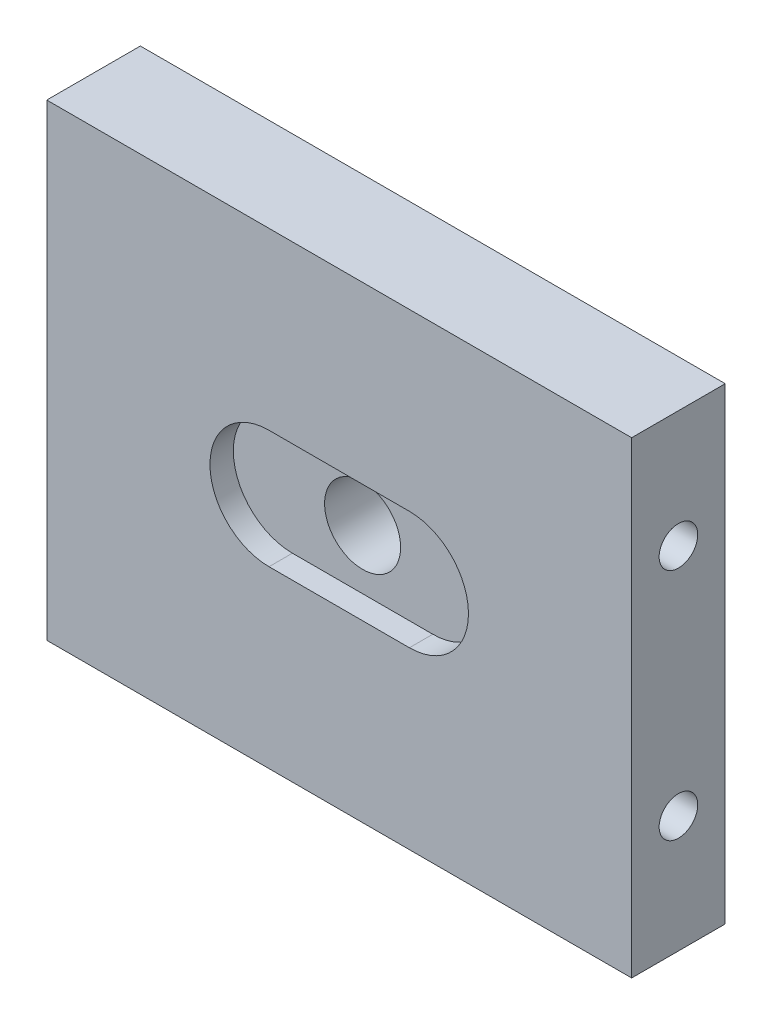
ISO-10303-21;
HEADER;
FILE_DESCRIPTION(('STEP AP214'),'2;1');
FILE_NAME('part.step','',(''),(''),'','','');
FILE_SCHEMA(('AUTOMOTIVE_DESIGN { 1 0 10303 214 1 1 1 1 }'));
ENDSEC;
DATA;
#1=APPLICATION_CONTEXT('core data for automotive mechanical design processes');
#2=APPLICATION_PROTOCOL_DEFINITION('international standard','automotive_design',2000,#1);
#3=PRODUCT_CONTEXT('',#1,'mechanical');
#4=PRODUCT('Part','Part','',(#3));
#5=PRODUCT_RELATED_PRODUCT_CATEGORY('part','',(#4));
#6=PRODUCT_DEFINITION_FORMATION('','',#4);
#7=PRODUCT_DEFINITION_CONTEXT('part definition',#1,'design');
#8=PRODUCT_DEFINITION('design','',#6,#7);
#9=PRODUCT_DEFINITION_SHAPE('','',#8);
#10=(LENGTH_UNIT() NAMED_UNIT(*) SI_UNIT(.MILLI.,.METRE.));
#11=(NAMED_UNIT(*) PLANE_ANGLE_UNIT() SI_UNIT($,.RADIAN.));
#12=(NAMED_UNIT(*) SI_UNIT($,.STERADIAN.) SOLID_ANGLE_UNIT());
#13=UNCERTAINTY_MEASURE_WITH_UNIT(LENGTH_MEASURE(1.E-05),#10,'distance_accuracy_value','');
#14=(GEOMETRIC_REPRESENTATION_CONTEXT(3) GLOBAL_UNCERTAINTY_ASSIGNED_CONTEXT((#13)) GLOBAL_UNIT_ASSIGNED_CONTEXT((#10,
#11,#12)) REPRESENTATION_CONTEXT('',''));
#15=CARTESIAN_POINT('',(0.,0.,0.));
#16=DIRECTION('',(0.,0.,1.));
#17=DIRECTION('',(1.,0.,0.));
#18=AXIS2_PLACEMENT_3D('',#15,#16,#17);
#19=CARTESIAN_POINT('',(25.,20.,8.));
#20=DIRECTION('',(-1.,0.,0.));
#21=DIRECTION('',(0.,-1.,0.));
#22=AXIS2_PLACEMENT_3D('',#19,#20,#21);
#23=PLANE('',#22);
#24=CARTESIAN_POINT('',(25.,9.99999999999999,4.));
#25=DIRECTION('',(1.,0.,0.));
#26=DIRECTION('',(0.,1.,0.));
#27=AXIS2_PLACEMENT_3D('',#24,#25,#26);
#28=CIRCLE('',#27,1.65);
#29=CARTESIAN_POINT('',(25.,11.65,4.));
#30=VERTEX_POINT('',#29);
#31=EDGE_CURVE('E197',#30,#30,#28,.T.);
#32=ORIENTED_EDGE('',*,*,#31,.F.);
#33=EDGE_LOOP('',(#32));
#34=FACE_BOUND('',#33,.T.);
#35=CARTESIAN_POINT('',(25.,-10.,4.));
#36=DIRECTION('',(1.,0.,0.));
#37=DIRECTION('',(0.,1.,0.));
#38=AXIS2_PLACEMENT_3D('',#35,#36,#37);
#39=CIRCLE('',#38,1.65);
#40=CARTESIAN_POINT('',(25.,-8.35,4.));
#41=VERTEX_POINT('',#40);
#42=EDGE_CURVE('E200',#41,#41,#39,.T.);
#43=ORIENTED_EDGE('',*,*,#42,.F.);
#44=EDGE_LOOP('',(#43));
#45=FACE_BOUND('',#44,.T.);
#46=DIRECTION('',(0.,1.,0.));
#47=VECTOR('',#46,1.);
#48=CARTESIAN_POINT('',(25.,20.,0.));
#49=LINE('',#48,#47);
#50=CARTESIAN_POINT('',(25.,-20.,0.));
#51=VERTEX_POINT('',#50);
#52=CARTESIAN_POINT('',(25.,20.,0.));
#53=VERTEX_POINT('',#52);
#54=EDGE_CURVE('E144',#51,#53,#49,.T.);
#55=ORIENTED_EDGE('',*,*,#54,.T.);
#56=DIRECTION('',(0.,0.,-1.));
#57=VECTOR('',#56,1.);
#58=CARTESIAN_POINT('',(25.,20.,8.));
#59=LINE('',#58,#57);
#60=CARTESIAN_POINT('',(25.,20.,8.));
#61=VERTEX_POINT('',#60);
#62=EDGE_CURVE('E11',#61,#53,#59,.T.);
#63=ORIENTED_EDGE('',*,*,#62,.F.);
#64=DIRECTION('',(0.,1.,0.));
#65=VECTOR('',#64,1.);
#66=CARTESIAN_POINT('',(25.,20.,8.));
#67=LINE('',#66,#65);
#68=CARTESIAN_POINT('',(25.,-20.,8.));
#69=VERTEX_POINT('',#68);
#70=EDGE_CURVE('E148',#69,#61,#67,.T.);
#71=ORIENTED_EDGE('',*,*,#70,.F.);
#72=DIRECTION('',(0.,0.,-1.));
#73=VECTOR('',#72,1.);
#74=CARTESIAN_POINT('',(25.,-20.,8.));
#75=LINE('',#74,#73);
#76=EDGE_CURVE('E154',#69,#51,#75,.T.);
#77=ORIENTED_EDGE('',*,*,#76,.T.);
#78=EDGE_LOOP('',(#55,#63,#71,#77));
#79=FACE_BOUND('',#78,.T.);
#80=ADVANCED_FACE('F33',(#34,#45,#79),#23,.F.);
#81=CARTESIAN_POINT('',(-25.,20.,8.));
#82=DIRECTION('',(0.,-1.,0.));
#83=DIRECTION('',(0.,0.,-1.));
#84=AXIS2_PLACEMENT_3D('',#81,#82,#83);
#85=PLANE('',#84);
#86=DIRECTION('',(-1.,0.,0.));
#87=VECTOR('',#86,1.);
#88=CARTESIAN_POINT('',(-25.,20.,0.));
#89=LINE('',#88,#87);
#90=CARTESIAN_POINT('',(-25.,20.,0.));
#91=VERTEX_POINT('',#90);
#92=EDGE_CURVE('E157',#53,#91,#89,.T.);
#93=ORIENTED_EDGE('',*,*,#92,.T.);
#94=DIRECTION('',(0.,0.,-1.));
#95=VECTOR('',#94,1.);
#96=CARTESIAN_POINT('',(-25.,20.,8.));
#97=LINE('',#96,#95);
#98=CARTESIAN_POINT('',(-25.,20.,8.));
#99=VERTEX_POINT('',#98);
#100=EDGE_CURVE('E40',#99,#91,#97,.T.);
#101=ORIENTED_EDGE('',*,*,#100,.F.);
#102=DIRECTION('',(-1.,0.,0.));
#103=VECTOR('',#102,1.);
#104=CARTESIAN_POINT('',(-25.,20.,8.));
#105=LINE('',#104,#103);
#106=EDGE_CURVE('E84',#61,#99,#105,.T.);
#107=ORIENTED_EDGE('',*,*,#106,.F.);
#108=ORIENTED_EDGE('',*,*,#62,.T.);
#109=EDGE_LOOP('',(#93,#101,#107,#108));
#110=FACE_BOUND('',#109,.T.);
#111=ADVANCED_FACE('F186',(#110),#85,.F.);
#112=CARTESIAN_POINT('',(-25.,20.,8.));
#113=DIRECTION('',(1.,0.,0.));
#114=DIRECTION('',(0.,1.,0.));
#115=AXIS2_PLACEMENT_3D('',#112,#113,#114);
#116=PLANE('',#115);
#117=DIRECTION('',(0.,-1.,0.));
#118=VECTOR('',#117,1.);
#119=CARTESIAN_POINT('',(-25.,20.,0.));
#120=LINE('',#119,#118);
#121=CARTESIAN_POINT('',(-25.,-20.,0.));
#122=VERTEX_POINT('',#121);
#123=EDGE_CURVE('E159',#91,#122,#120,.T.);
#124=ORIENTED_EDGE('',*,*,#123,.T.);
#125=DIRECTION('',(0.,0.,-1.));
#126=VECTOR('',#125,1.);
#127=CARTESIAN_POINT('',(-25.,-20.,8.));
#128=LINE('',#127,#126);
#129=CARTESIAN_POINT('',(-25.,-20.,8.));
#130=VERTEX_POINT('',#129);
#131=EDGE_CURVE('E163',#130,#122,#128,.T.);
#132=ORIENTED_EDGE('',*,*,#131,.F.);
#133=DIRECTION('',(0.,-1.,0.));
#134=VECTOR('',#133,1.);
#135=CARTESIAN_POINT('',(-25.,20.,8.));
#136=LINE('',#135,#134);
#137=EDGE_CURVE('E151',#99,#130,#136,.T.);
#138=ORIENTED_EDGE('',*,*,#137,.F.);
#139=ORIENTED_EDGE('',*,*,#100,.T.);
#140=EDGE_LOOP('',(#124,#132,#138,#139));
#141=FACE_BOUND('',#140,.T.);
#142=ADVANCED_FACE('F168',(#141),#116,.F.);
#143=CARTESIAN_POINT('',(-25.,-20.,8.));
#144=DIRECTION('',(0.,1.,0.));
#145=DIRECTION('',(0.,0.,1.));
#146=AXIS2_PLACEMENT_3D('',#143,#144,#145);
#147=PLANE('',#146);
#148=DIRECTION('',(1.,0.,0.));
#149=VECTOR('',#148,1.);
#150=CARTESIAN_POINT('',(-25.,-20.,0.));
#151=LINE('',#150,#149);
#152=EDGE_CURVE('E77',#122,#51,#151,.T.);
#153=ORIENTED_EDGE('',*,*,#152,.T.);
#154=ORIENTED_EDGE('',*,*,#76,.F.);
#155=DIRECTION('',(1.,0.,0.));
#156=VECTOR('',#155,1.);
#157=CARTESIAN_POINT('',(-25.,-20.,8.));
#158=LINE('',#157,#156);
#159=EDGE_CURVE('E56',#130,#69,#158,.T.);
#160=ORIENTED_EDGE('',*,*,#159,.F.);
#161=ORIENTED_EDGE('',*,*,#131,.T.);
#162=EDGE_LOOP('',(#153,#154,#160,#161));
#163=FACE_BOUND('',#162,.T.);
#164=ADVANCED_FACE('F176',(#163),#147,.F.);
#165=CARTESIAN_POINT('',(0.,0.,8.));
#166=DIRECTION('',(0.,0.,1.));
#167=DIRECTION('',(1.,0.,0.));
#168=AXIS2_PLACEMENT_3D('',#165,#166,#167);
#169=PLANE('',#168);
#170=CARTESIAN_POINT('',(-6.00000000000001,0.,8.));
#171=DIRECTION('',(0.,0.,1.));
#172=DIRECTION('',(1.,0.,0.));
#173=AXIS2_PLACEMENT_3D('',#170,#171,#172);
#174=CIRCLE('',#173,5.05);
#175=CARTESIAN_POINT('',(-6.00000000000001,5.05,8.));
#176=VERTEX_POINT('',#175);
#177=CARTESIAN_POINT('',(-6.00000000000001,-5.05,8.));
#178=VERTEX_POINT('',#177);
#179=EDGE_CURVE('E47',#176,#178,#174,.T.);
#180=ORIENTED_EDGE('',*,*,#179,.F.);
#181=DIRECTION('',(-1.,0.,0.));
#182=VECTOR('',#181,1.);
#183=CARTESIAN_POINT('',(-6.00000000000001,5.05,8.));
#184=LINE('',#183,#182);
#185=CARTESIAN_POINT('',(5.99999999999999,5.05,8.));
#186=VERTEX_POINT('',#185);
#187=EDGE_CURVE('E126',#186,#176,#184,.T.);
#188=ORIENTED_EDGE('',*,*,#187,.F.);
#189=CARTESIAN_POINT('',(5.99999999999999,0.,8.));
#190=DIRECTION('',(0.,0.,1.));
#191=DIRECTION('',(-1.,0.,0.));
#192=AXIS2_PLACEMENT_3D('',#189,#190,#191);
#193=CIRCLE('',#192,5.05);
#194=CARTESIAN_POINT('',(5.99999999999999,-5.05,8.));
#195=VERTEX_POINT('',#194);
#196=EDGE_CURVE('E129',#195,#186,#193,.T.);
#197=ORIENTED_EDGE('',*,*,#196,.F.);
#198=DIRECTION('',(1.,0.,0.));
#199=VECTOR('',#198,1.);
#200=CARTESIAN_POINT('',(5.99999999999999,-5.05,8.));
#201=LINE('',#200,#199);
#202=EDGE_CURVE('E138',#178,#195,#201,.T.);
#203=ORIENTED_EDGE('',*,*,#202,.F.);
#204=EDGE_LOOP('',(#180,#188,#197,#203));
#205=FACE_BOUND('',#204,.T.);
#206=ORIENTED_EDGE('',*,*,#70,.T.);
#207=ORIENTED_EDGE('',*,*,#106,.T.);
#208=ORIENTED_EDGE('',*,*,#137,.T.);
#209=ORIENTED_EDGE('',*,*,#159,.T.);
#210=EDGE_LOOP('',(#206,#207,#208,#209));
#211=FACE_BOUND('',#210,.T.);
#212=ADVANCED_FACE('F178',(#205,#211),#169,.T.);
#213=CARTESIAN_POINT('',(0.,0.,0.));
#214=DIRECTION('',(0.,0.,1.));
#215=DIRECTION('',(1.,0.,0.));
#216=AXIS2_PLACEMENT_3D('',#213,#214,#215);
#217=PLANE('',#216);
#218=CARTESIAN_POINT('',(0.,0.,0.));
#219=DIRECTION('',(0.,0.,1.));
#220=DIRECTION('',(1.,0.,0.));
#221=AXIS2_PLACEMENT_3D('',#218,#219,#220);
#222=CIRCLE('',#221,3.25);
#223=CARTESIAN_POINT('',(3.25,0.,0.));
#224=VERTEX_POINT('',#223);
#225=EDGE_CURVE('E132',#224,#224,#222,.T.);
#226=ORIENTED_EDGE('',*,*,#225,.T.);
#227=EDGE_LOOP('',(#226));
#228=FACE_BOUND('',#227,.T.);
#229=ORIENTED_EDGE('',*,*,#54,.F.);
#230=ORIENTED_EDGE('',*,*,#152,.F.);
#231=ORIENTED_EDGE('',*,*,#123,.F.);
#232=ORIENTED_EDGE('',*,*,#92,.F.);
#233=EDGE_LOOP('',(#229,#230,#231,#232));
#234=FACE_BOUND('',#233,.T.);
#235=ADVANCED_FACE('F172',(#228,#234),#217,.F.);
#236=CARTESIAN_POINT('',(-6.00000000000001,0.,6.));
#237=DIRECTION('',(0.,0.,1.));
#238=DIRECTION('',(1.,0.,0.));
#239=AXIS2_PLACEMENT_3D('',#236,#237,#238);
#240=CYLINDRICAL_SURFACE('',#239,5.05);
#241=ORIENTED_EDGE('',*,*,#179,.T.);
#242=DIRECTION('',(0.,0.,1.));
#243=VECTOR('',#242,1.);
#244=CARTESIAN_POINT('',(-6.00000000000001,-5.05,6.));
#245=LINE('',#244,#243);
#246=CARTESIAN_POINT('',(-6.00000000000001,-5.05,6.));
#247=VERTEX_POINT('',#246);
#248=EDGE_CURVE('E104',#247,#178,#245,.T.);
#249=ORIENTED_EDGE('',*,*,#248,.F.);
#250=CARTESIAN_POINT('',(-6.00000000000001,0.,6.));
#251=DIRECTION('',(0.,0.,1.));
#252=DIRECTION('',(1.,0.,0.));
#253=AXIS2_PLACEMENT_3D('',#250,#251,#252);
#254=CIRCLE('',#253,5.05);
#255=CARTESIAN_POINT('',(-6.00000000000001,5.05,6.));
#256=VERTEX_POINT('',#255);
#257=EDGE_CURVE('E108',#256,#247,#254,.T.);
#258=ORIENTED_EDGE('',*,*,#257,.F.);
#259=DIRECTION('',(0.,0.,1.));
#260=VECTOR('',#259,1.);
#261=CARTESIAN_POINT('',(-6.00000000000001,5.05,6.));
#262=LINE('',#261,#260);
#263=EDGE_CURVE('E142',#256,#176,#262,.T.);
#264=ORIENTED_EDGE('',*,*,#263,.T.);
#265=EDGE_LOOP('',(#241,#249,#258,#264));
#266=FACE_BOUND('',#265,.T.);
#267=ADVANCED_FACE('F106',(#266),#240,.F.);
#268=CARTESIAN_POINT('',(-6.00000000000001,5.05,6.));
#269=DIRECTION('',(0.,1.,0.));
#270=DIRECTION('',(-1.,0.,0.));
#271=AXIS2_PLACEMENT_3D('',#268,#269,#270);
#272=PLANE('',#271);
#273=ORIENTED_EDGE('',*,*,#187,.T.);
#274=ORIENTED_EDGE('',*,*,#263,.F.);
#275=DIRECTION('',(-1.,0.,0.));
#276=VECTOR('',#275,1.);
#277=CARTESIAN_POINT('',(-6.00000000000001,5.05,6.));
#278=LINE('',#277,#276);
#279=CARTESIAN_POINT('',(5.99999999999999,5.05,6.));
#280=VERTEX_POINT('',#279);
#281=EDGE_CURVE('E114',#280,#256,#278,.T.);
#282=ORIENTED_EDGE('',*,*,#281,.F.);
#283=DIRECTION('',(0.,0.,1.));
#284=VECTOR('',#283,1.);
#285=CARTESIAN_POINT('',(5.99999999999999,5.05,6.));
#286=LINE('',#285,#284);
#287=EDGE_CURVE('E145',#280,#186,#286,.T.);
#288=ORIENTED_EDGE('',*,*,#287,.T.);
#289=EDGE_LOOP('',(#273,#274,#282,#288));
#290=FACE_BOUND('',#289,.T.);
#291=ADVANCED_FACE('F233',(#290),#272,.F.);
#292=CARTESIAN_POINT('',(5.99999999999999,0.,6.));
#293=DIRECTION('',(0.,0.,1.));
#294=DIRECTION('',(1.,0.,0.));
#295=AXIS2_PLACEMENT_3D('',#292,#293,#294);
#296=CYLINDRICAL_SURFACE('',#295,5.05);
#297=ORIENTED_EDGE('',*,*,#196,.T.);
#298=ORIENTED_EDGE('',*,*,#287,.F.);
#299=CARTESIAN_POINT('',(5.99999999999999,0.,6.));
#300=DIRECTION('',(0.,0.,1.));
#301=DIRECTION('',(-1.,0.,0.));
#302=AXIS2_PLACEMENT_3D('',#299,#300,#301);
#303=CIRCLE('',#302,5.05);
#304=CARTESIAN_POINT('',(5.99999999999999,-5.05,6.));
#305=VERTEX_POINT('',#304);
#306=EDGE_CURVE('E122',#305,#280,#303,.T.);
#307=ORIENTED_EDGE('',*,*,#306,.F.);
#308=DIRECTION('',(0.,0.,1.));
#309=VECTOR('',#308,1.);
#310=CARTESIAN_POINT('',(5.99999999999999,-5.05,6.));
#311=LINE('',#310,#309);
#312=EDGE_CURVE('E113',#305,#195,#311,.T.);
#313=ORIENTED_EDGE('',*,*,#312,.T.);
#314=EDGE_LOOP('',(#297,#298,#307,#313));
#315=FACE_BOUND('',#314,.T.);
#316=ADVANCED_FACE('F236',(#315),#296,.F.);
#317=CARTESIAN_POINT('',(5.99999999999999,-5.05,6.));
#318=DIRECTION('',(0.,-1.,0.));
#319=DIRECTION('',(1.,0.,0.));
#320=AXIS2_PLACEMENT_3D('',#317,#318,#319);
#321=PLANE('',#320);
#322=ORIENTED_EDGE('',*,*,#202,.T.);
#323=ORIENTED_EDGE('',*,*,#312,.F.);
#324=DIRECTION('',(1.,0.,0.));
#325=VECTOR('',#324,1.);
#326=CARTESIAN_POINT('',(5.99999999999999,-5.05,6.));
#327=LINE('',#326,#325);
#328=EDGE_CURVE('E117',#247,#305,#327,.T.);
#329=ORIENTED_EDGE('',*,*,#328,.F.);
#330=ORIENTED_EDGE('',*,*,#248,.T.);
#331=EDGE_LOOP('',(#322,#323,#329,#330));
#332=FACE_BOUND('',#331,.T.);
#333=ADVANCED_FACE('F118',(#332),#321,.F.);
#334=CARTESIAN_POINT('',(-6.00000000000001,0.,6.));
#335=DIRECTION('',(0.,0.,1.));
#336=DIRECTION('',(1.,0.,0.));
#337=AXIS2_PLACEMENT_3D('',#334,#335,#336);
#338=PLANE('',#337);
#339=CARTESIAN_POINT('',(0.,0.,6.));
#340=DIRECTION('',(0.,0.,1.));
#341=DIRECTION('',(1.,0.,0.));
#342=AXIS2_PLACEMENT_3D('',#339,#340,#341);
#343=CIRCLE('',#342,3.25);
#344=CARTESIAN_POINT('',(3.25,0.,6.));
#345=VERTEX_POINT('',#344);
#346=EDGE_CURVE('E206',#345,#345,#343,.T.);
#347=ORIENTED_EDGE('',*,*,#346,.F.);
#348=EDGE_LOOP('',(#347));
#349=FACE_BOUND('',#348,.T.);
#350=ORIENTED_EDGE('',*,*,#257,.T.);
#351=ORIENTED_EDGE('',*,*,#328,.T.);
#352=ORIENTED_EDGE('',*,*,#306,.T.);
#353=ORIENTED_EDGE('',*,*,#281,.T.);
#354=EDGE_LOOP('',(#350,#351,#352,#353));
#355=FACE_BOUND('',#354,.T.);
#356=ADVANCED_FACE('F124',(#349,#355),#338,.T.);
#357=CARTESIAN_POINT('',(0.,0.,-4.));
#358=DIRECTION('',(0.,0.,1.));
#359=DIRECTION('',(1.,0.,0.));
#360=AXIS2_PLACEMENT_3D('',#357,#358,#359);
#361=CYLINDRICAL_SURFACE('',#360,3.25);
#362=ORIENTED_EDGE('',*,*,#346,.T.);
#363=EDGE_LOOP('',(#362));
#364=FACE_BOUND('',#363,.T.);
#365=ORIENTED_EDGE('',*,*,#225,.F.);
#366=EDGE_LOOP('',(#365));
#367=FACE_BOUND('',#366,.T.);
#368=ADVANCED_FACE('F218',(#364,#367),#361,.F.);
#369=CARTESIAN_POINT('',(10.,-10.,4.));
#370=DIRECTION('',(1.,0.,0.));
#371=DIRECTION('',(0.,1.,0.));
#372=AXIS2_PLACEMENT_3D('',#369,#370,#371);
#373=CYLINDRICAL_SURFACE('',#372,1.65);
#374=CARTESIAN_POINT('',(10.,-10.,4.));
#375=DIRECTION('',(1.,0.,0.));
#376=DIRECTION('',(0.,1.,0.));
#377=AXIS2_PLACEMENT_3D('',#374,#375,#376);
#378=CIRCLE('',#377,1.65);
#379=CARTESIAN_POINT('',(10.,-8.35,4.));
#380=VERTEX_POINT('',#379);
#381=EDGE_CURVE('E202',#380,#380,#378,.T.);
#382=ORIENTED_EDGE('',*,*,#381,.F.);
#383=EDGE_LOOP('',(#382));
#384=FACE_BOUND('',#383,.T.);
#385=ORIENTED_EDGE('',*,*,#42,.T.);
#386=EDGE_LOOP('',(#385));
#387=FACE_BOUND('',#386,.T.);
#388=ADVANCED_FACE('F220',(#384,#387),#373,.F.);
#389=CARTESIAN_POINT('',(10.,-10.,4.));
#390=DIRECTION('',(1.,0.,0.));
#391=DIRECTION('',(0.,1.,0.));
#392=AXIS2_PLACEMENT_3D('',#389,#390,#391);
#393=PLANE('',#392);
#394=ORIENTED_EDGE('',*,*,#381,.T.);
#395=EDGE_LOOP('',(#394));
#396=FACE_BOUND('',#395,.T.);
#397=ADVANCED_FACE('F226',(#396),#393,.T.);
#398=CARTESIAN_POINT('',(10.,9.99999999999999,4.));
#399=DIRECTION('',(1.,0.,0.));
#400=DIRECTION('',(0.,1.,0.));
#401=AXIS2_PLACEMENT_3D('',#398,#399,#400);
#402=CYLINDRICAL_SURFACE('',#401,1.65);
#403=CARTESIAN_POINT('',(10.,9.99999999999999,4.));
#404=DIRECTION('',(1.,0.,0.));
#405=DIRECTION('',(0.,1.,0.));
#406=AXIS2_PLACEMENT_3D('',#403,#404,#405);
#407=CIRCLE('',#406,1.65);
#408=CARTESIAN_POINT('',(10.,11.65,4.));
#409=VERTEX_POINT('',#408);
#410=EDGE_CURVE('E203',#409,#409,#407,.T.);
#411=ORIENTED_EDGE('',*,*,#410,.F.);
#412=EDGE_LOOP('',(#411));
#413=FACE_BOUND('',#412,.T.);
#414=ORIENTED_EDGE('',*,*,#31,.T.);
#415=EDGE_LOOP('',(#414));
#416=FACE_BOUND('',#415,.T.);
#417=ADVANCED_FACE('F293',(#413,#416),#402,.F.);
#418=CARTESIAN_POINT('',(10.,9.99999999999999,4.));
#419=DIRECTION('',(1.,0.,0.));
#420=DIRECTION('',(0.,1.,0.));
#421=AXIS2_PLACEMENT_3D('',#418,#419,#420);
#422=PLANE('',#421);
#423=ORIENTED_EDGE('',*,*,#410,.T.);
#424=EDGE_LOOP('',(#423));
#425=FACE_BOUND('',#424,.T.);
#426=ADVANCED_FACE('F302',(#425),#422,.T.);
#427=CLOSED_SHELL('',(#80,#111,#142,#164,#212,#235,#267,#291,#316,#333,#356,#368,#388,#397,#417,#426));
#428=MANIFOLD_SOLID_BREP('B2',#427);
#429=ADVANCED_BREP_SHAPE_REPRESENTATION('',(#18,#428),#14);
#430=SHAPE_DEFINITION_REPRESENTATION(#9,#429);
ENDSEC;
END-ISO-10303-21;
